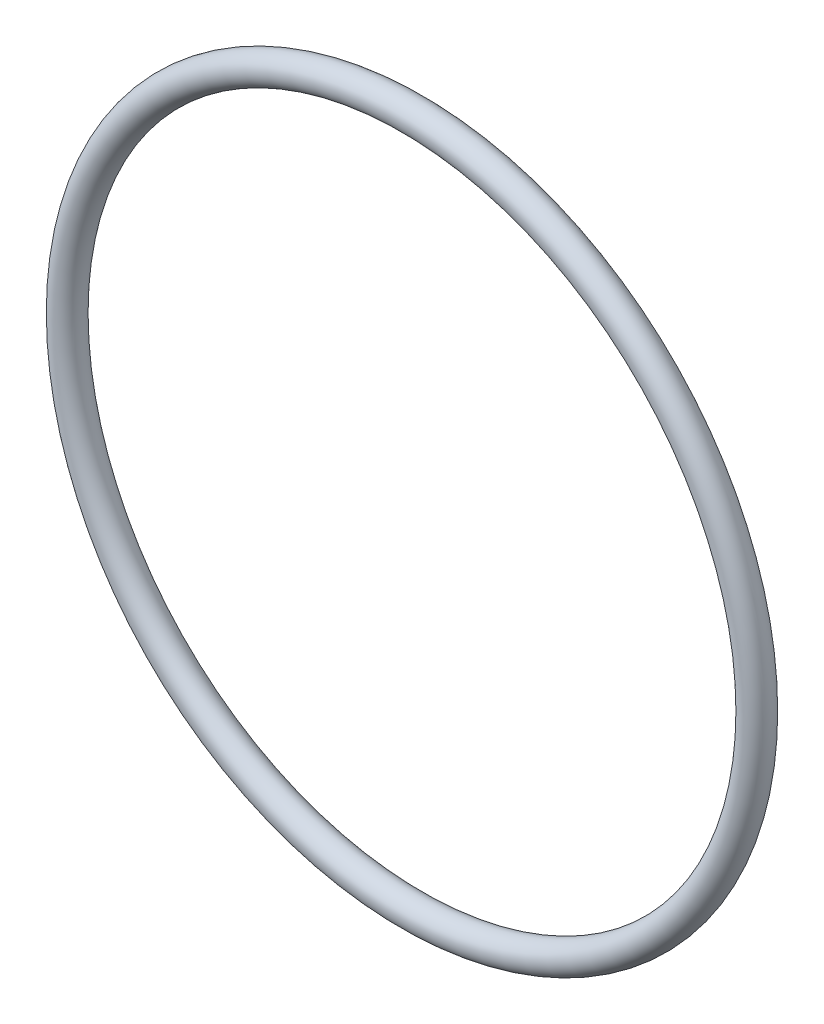
ISO-10303-21;
HEADER;
FILE_DESCRIPTION(('STEP AP214'),'2;1');
FILE_NAME('part.step','',(''),(''),'','','');
FILE_SCHEMA(('AUTOMOTIVE_DESIGN { 1 0 10303 214 1 1 1 1 }'));
ENDSEC;
DATA;
#1=APPLICATION_CONTEXT('core data for automotive mechanical design processes');
#2=APPLICATION_PROTOCOL_DEFINITION('international standard','automotive_design',2000,#1);
#3=PRODUCT_CONTEXT('',#1,'mechanical');
#4=PRODUCT('Part','Part','',(#3));
#5=PRODUCT_RELATED_PRODUCT_CATEGORY('part','',(#4));
#6=PRODUCT_DEFINITION_FORMATION('','',#4);
#7=PRODUCT_DEFINITION_CONTEXT('part definition',#1,'design');
#8=PRODUCT_DEFINITION('design','',#6,#7);
#9=PRODUCT_DEFINITION_SHAPE('','',#8);
#10=(LENGTH_UNIT() NAMED_UNIT(*) SI_UNIT(.MILLI.,.METRE.));
#11=(NAMED_UNIT(*) PLANE_ANGLE_UNIT() SI_UNIT($,.RADIAN.));
#12=(NAMED_UNIT(*) SI_UNIT($,.STERADIAN.) SOLID_ANGLE_UNIT());
#13=UNCERTAINTY_MEASURE_WITH_UNIT(LENGTH_MEASURE(1.E-05),#10,'distance_accuracy_value','');
#14=(GEOMETRIC_REPRESENTATION_CONTEXT(3) GLOBAL_UNCERTAINTY_ASSIGNED_CONTEXT((#13)) GLOBAL_UNIT_ASSIGNED_CONTEXT((#10,
#11,#12)) REPRESENTATION_CONTEXT('',''));
#15=CARTESIAN_POINT('',(0.,0.,0.));
#16=DIRECTION('',(0.,0.,1.));
#17=DIRECTION('',(1.,0.,0.));
#18=AXIS2_PLACEMENT_3D('',#15,#16,#17);
#19=CARTESIAN_POINT('',(0.,0.,0.));
#20=DIRECTION('',(0.,0.,-1.));
#21=DIRECTION('',(-1.,0.,0.));
#22=AXIS2_PLACEMENT_3D('',#19,#20,#21);
#23=TOROIDAL_SURFACE('',#22,35.,1.5);
#24=CARTESIAN_POINT('',(-36.5,0.,0.));
#25=VERTEX_POINT('',#24);
#26=VERTEX_LOOP('',#25);
#27=FACE_BOUND('',#26,.T.);
#28=ADVANCED_FACE('F37',(#27),#23,.T.);
#29=CLOSED_SHELL('',(#28));
#30=MANIFOLD_SOLID_BREP('B2',#29);
#31=ADVANCED_BREP_SHAPE_REPRESENTATION('',(#18,#30),#14);
#32=SHAPE_DEFINITION_REPRESENTATION(#9,#31);
ENDSEC;
END-ISO-10303-21;
